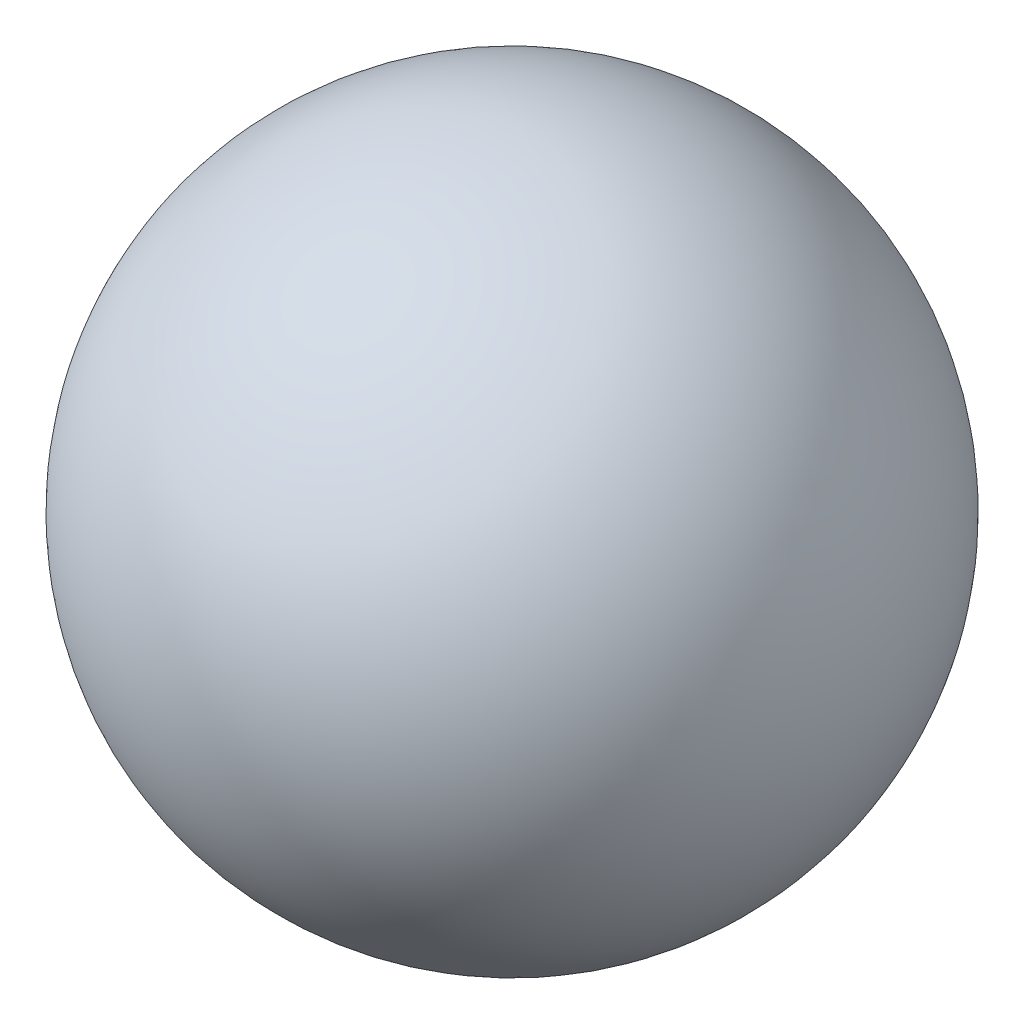
ISO-10303-21;
HEADER;
FILE_DESCRIPTION(('STEP AP214'),'2;1');
FILE_NAME('part.step','',(''),(''),'','','');
FILE_SCHEMA(('AUTOMOTIVE_DESIGN { 1 0 10303 214 1 1 1 1 }'));
ENDSEC;
DATA;
#1=APPLICATION_CONTEXT('core data for automotive mechanical design processes');
#2=APPLICATION_PROTOCOL_DEFINITION('international standard','automotive_design',2000,#1);
#3=PRODUCT_CONTEXT('',#1,'mechanical');
#4=PRODUCT('Part','Part','',(#3));
#5=PRODUCT_RELATED_PRODUCT_CATEGORY('part','',(#4));
#6=PRODUCT_DEFINITION_FORMATION('','',#4);
#7=PRODUCT_DEFINITION_CONTEXT('part definition',#1,'design');
#8=PRODUCT_DEFINITION('design','',#6,#7);
#9=PRODUCT_DEFINITION_SHAPE('','',#8);
#10=(LENGTH_UNIT() NAMED_UNIT(*) SI_UNIT(.MILLI.,.METRE.));
#11=(NAMED_UNIT(*) PLANE_ANGLE_UNIT() SI_UNIT($,.RADIAN.));
#12=(NAMED_UNIT(*) SI_UNIT($,.STERADIAN.) SOLID_ANGLE_UNIT());
#13=UNCERTAINTY_MEASURE_WITH_UNIT(LENGTH_MEASURE(1.E-05),#10,'distance_accuracy_value','');
#14=(GEOMETRIC_REPRESENTATION_CONTEXT(3) GLOBAL_UNCERTAINTY_ASSIGNED_CONTEXT((#13)) GLOBAL_UNIT_ASSIGNED_CONTEXT((#10,
#11,#12)) REPRESENTATION_CONTEXT('',''));
#15=CARTESIAN_POINT('',(0.,0.,0.));
#16=DIRECTION('',(0.,0.,1.));
#17=DIRECTION('',(1.,0.,0.));
#18=AXIS2_PLACEMENT_3D('',#15,#16,#17);
#19=CARTESIAN_POINT('',(0.,0.,0.));
#20=DIRECTION('',(1.,0.,0.));
#21=DIRECTION('',(0.,-1.,0.));
#22=AXIS2_PLACEMENT_3D('',#19,#20,#21);
#23=SPHERICAL_SURFACE('',#22,32.);
#24=CARTESIAN_POINT('',(32.,0.,0.));
#25=VERTEX_POINT('',#24);
#26=VERTEX_LOOP('',#25);
#27=FACE_BOUND('',#26,.T.);
#28=ADVANCED_FACE('F39',(#27),#23,.T.);
#29=CLOSED_SHELL('',(#28));
#30=MANIFOLD_SOLID_BREP('B2',#29);
#31=ADVANCED_BREP_SHAPE_REPRESENTATION('',(#18,#30),#14);
#32=SHAPE_DEFINITION_REPRESENTATION(#9,#31);
ENDSEC;
END-ISO-10303-21;
